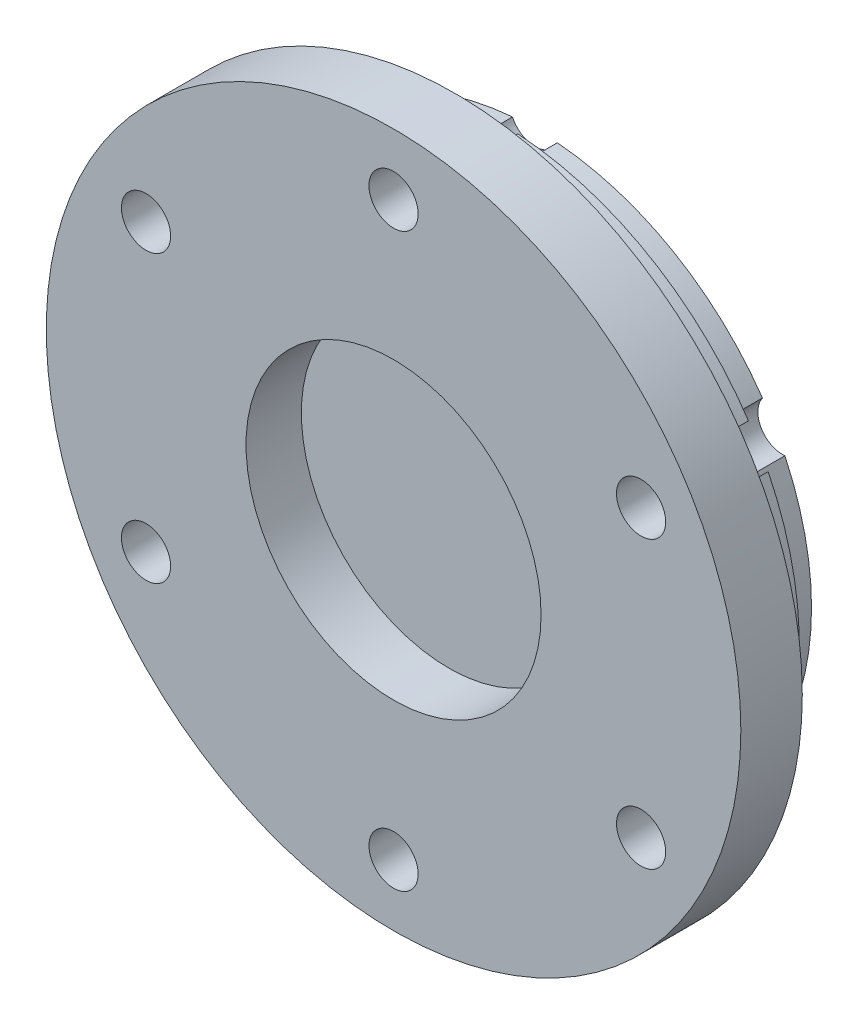
ISO-10303-21;
HEADER;
FILE_DESCRIPTION(('STEP AP214'),'2;1');
FILE_NAME('part.step','',(''),(''),'','','');
FILE_SCHEMA(('AUTOMOTIVE_DESIGN { 1 0 10303 214 1 1 1 1 }'));
ENDSEC;
DATA;
#1=APPLICATION_CONTEXT('core data for automotive mechanical design processes');
#2=APPLICATION_PROTOCOL_DEFINITION('international standard','automotive_design',2000,#1);
#3=PRODUCT_CONTEXT('',#1,'mechanical');
#4=PRODUCT('Part','Part','',(#3));
#5=PRODUCT_RELATED_PRODUCT_CATEGORY('part','',(#4));
#6=PRODUCT_DEFINITION_FORMATION('','',#4);
#7=PRODUCT_DEFINITION_CONTEXT('part definition',#1,'design');
#8=PRODUCT_DEFINITION('design','',#6,#7);
#9=PRODUCT_DEFINITION_SHAPE('','',#8);
#10=(LENGTH_UNIT() NAMED_UNIT(*) SI_UNIT(.MILLI.,.METRE.));
#11=(NAMED_UNIT(*) PLANE_ANGLE_UNIT() SI_UNIT($,.RADIAN.));
#12=(NAMED_UNIT(*) SI_UNIT($,.STERADIAN.) SOLID_ANGLE_UNIT());
#13=UNCERTAINTY_MEASURE_WITH_UNIT(LENGTH_MEASURE(1.E-05),#10,'distance_accuracy_value','');
#14=(GEOMETRIC_REPRESENTATION_CONTEXT(3) GLOBAL_UNCERTAINTY_ASSIGNED_CONTEXT((#13)) GLOBAL_UNIT_ASSIGNED_CONTEXT((#10,
#11,#12)) REPRESENTATION_CONTEXT('',''));
#15=CARTESIAN_POINT('',(0.,0.,0.));
#16=DIRECTION('',(0.,0.,1.));
#17=DIRECTION('',(1.,0.,0.));
#18=AXIS2_PLACEMENT_3D('',#15,#16,#17);
#19=CARTESIAN_POINT('',(0.,0.,0.));
#20=DIRECTION('',(0.,0.,1.));
#21=DIRECTION('',(1.,0.,0.));
#22=AXIS2_PLACEMENT_3D('',#19,#20,#21);
#23=CYLINDRICAL_SURFACE('',#22,22.5);
#24=CARTESIAN_POINT('',(0.,0.,-11.5));
#25=DIRECTION('',(0.,0.,-1.));
#26=DIRECTION('',(-1.,0.,0.));
#27=AXIS2_PLACEMENT_3D('',#24,#25,#26);
#28=CIRCLE('',#27,22.5);
#29=CARTESIAN_POINT('',(1.8224017222735,22.4260752688172,-11.5));
#30=VERTEX_POINT('',#29);
#31=CARTESIAN_POINT('',(18.5103500288407,12.7912838217982,-11.5));
#32=VERTEX_POINT('',#31);
#33=EDGE_CURVE('E64',#30,#32,#28,.T.);
#34=ORIENTED_EDGE('',*,*,#33,.F.);
#35=DIRECTION('',(0.,0.,-1.));
#36=VECTOR('',#35,1.);
#37=CARTESIAN_POINT('',(1.82240172227348,22.4260752688172,-13.25));
#38=LINE('',#37,#36);
#39=CARTESIAN_POINT('',(1.82240172227348,22.4260752688172,-8.5));
#40=VERTEX_POINT('',#39);
#41=EDGE_CURVE('E218',#30,#40,#38,.F.);
#42=ORIENTED_EDGE('',*,*,#41,.T.);
#43=CARTESIAN_POINT('',(0.,0.,-8.5));
#44=DIRECTION('',(0.,0.,1.));
#45=DIRECTION('',(1.,0.,0.));
#46=AXIS2_PLACEMENT_3D('',#43,#44,#45);
#47=CIRCLE('',#46,22.5);
#48=CARTESIAN_POINT('',(18.5103500288408,12.7912838217981,-8.5));
#49=VERTEX_POINT('',#48);
#50=EDGE_CURVE('E254',#49,#40,#47,.T.);
#51=ORIENTED_EDGE('',*,*,#50,.F.);
#52=DIRECTION('',(0.,0.,-1.));
#53=VECTOR('',#52,1.);
#54=CARTESIAN_POINT('',(18.5103500288407,12.7912838217982,-13.25));
#55=LINE('',#54,#53);
#56=EDGE_CURVE('E220',#49,#32,#55,.T.);
#57=ORIENTED_EDGE('',*,*,#56,.T.);
#58=EDGE_LOOP('',(#34,#42,#51,#57));
#59=FACE_BOUND('',#58,.T.);
#60=ADVANCED_FACE('F48',(#59),#23,.T.);
#61=CARTESIAN_POINT('',(0.,0.,-11.5));
#62=DIRECTION('',(0.,0.,-1.));
#63=DIRECTION('',(-1.,0.,0.));
#64=AXIS2_PLACEMENT_3D('',#61,#62,#63);
#65=CIRCLE('',#64,22.5);
#66=CARTESIAN_POINT('',(20.3327517511143,9.63479144701948,-11.5));
#67=VERTEX_POINT('',#66);
#68=CARTESIAN_POINT('',(20.3327517511145,-9.63479144701905,-11.5));
#69=VERTEX_POINT('',#68);
#70=EDGE_CURVE('E548',#67,#69,#65,.T.);
#71=ORIENTED_EDGE('',*,*,#70,.F.);
#72=DIRECTION('',(0.,0.,-1.));
#73=VECTOR('',#72,1.);
#74=CARTESIAN_POINT('',(20.3327517511143,9.63479144701949,-13.25));
#75=LINE('',#74,#73);
#76=CARTESIAN_POINT('',(20.3327517511143,9.63479144701949,-8.5));
#77=VERTEX_POINT('',#76);
#78=EDGE_CURVE('E418',#67,#77,#75,.F.);
#79=ORIENTED_EDGE('',*,*,#78,.T.);
#80=CARTESIAN_POINT('',(20.3327517511144,-9.6347914470191,-8.5));
#81=VERTEX_POINT('',#80);
#82=EDGE_CURVE('E437',#81,#77,#47,.T.);
#83=ORIENTED_EDGE('',*,*,#82,.F.);
#84=DIRECTION('',(0.,0.,-1.));
#85=VECTOR('',#84,1.);
#86=CARTESIAN_POINT('',(20.3327517511145,-9.63479144701906,-13.25));
#87=LINE('',#86,#85);
#88=EDGE_CURVE('E414',#81,#69,#87,.T.);
#89=ORIENTED_EDGE('',*,*,#88,.T.);
#90=EDGE_LOOP('',(#71,#79,#83,#89));
#91=FACE_BOUND('',#90,.T.);
#92=ADVANCED_FACE('F556',(#91),#23,.T.);
#93=CARTESIAN_POINT('',(0.,0.,-11.5));
#94=DIRECTION('',(0.,0.,-1.));
#95=DIRECTION('',(-1.,0.,0.));
#96=AXIS2_PLACEMENT_3D('',#93,#94,#95);
#97=CIRCLE('',#96,22.5);
#98=CARTESIAN_POINT('',(18.510350028841,-12.7912838217978,-11.5));
#99=VERTEX_POINT('',#98);
#100=CARTESIAN_POINT('',(1.82240172227348,-22.4260752688172,-11.5));
#101=VERTEX_POINT('',#100);
#102=EDGE_CURVE('E542',#99,#101,#97,.T.);
#103=ORIENTED_EDGE('',*,*,#102,.F.);
#104=DIRECTION('',(0.,0.,-1.));
#105=VECTOR('',#104,1.);
#106=CARTESIAN_POINT('',(18.510350028841,-12.7912838217978,-13.25));
#107=LINE('',#106,#105);
#108=CARTESIAN_POINT('',(18.510350028841,-12.7912838217978,-8.5));
#109=VERTEX_POINT('',#108);
#110=EDGE_CURVE('E398',#99,#109,#107,.F.);
#111=ORIENTED_EDGE('',*,*,#110,.T.);
#112=CARTESIAN_POINT('',(1.82240172227344,-22.4260752688172,-8.5));
#113=VERTEX_POINT('',#112);
#114=EDGE_CURVE('E440',#113,#109,#47,.T.);
#115=ORIENTED_EDGE('',*,*,#114,.F.);
#116=DIRECTION('',(0.,0.,-1.));
#117=VECTOR('',#116,1.);
#118=CARTESIAN_POINT('',(1.82240172227348,-22.4260752688172,-13.25));
#119=LINE('',#118,#117);
#120=EDGE_CURVE('E394',#113,#101,#119,.T.);
#121=ORIENTED_EDGE('',*,*,#120,.T.);
#122=EDGE_LOOP('',(#103,#111,#115,#121));
#123=FACE_BOUND('',#122,.T.);
#124=ADVANCED_FACE('F566',(#123),#23,.T.);
#125=CARTESIAN_POINT('',(0.,0.,-11.5));
#126=DIRECTION('',(0.,0.,-1.));
#127=DIRECTION('',(-1.,0.,0.));
#128=AXIS2_PLACEMENT_3D('',#125,#126,#127);
#129=CIRCLE('',#128,22.5);
#130=CARTESIAN_POINT('',(-1.82240172227349,-22.4260752688172,-11.5));
#131=VERTEX_POINT('',#130);
#132=CARTESIAN_POINT('',(-18.5103500288408,-12.791283821798,-11.5));
#133=VERTEX_POINT('',#132);
#134=EDGE_CURVE('E458',#131,#133,#129,.T.);
#135=ORIENTED_EDGE('',*,*,#134,.F.);
#136=DIRECTION('',(0.,0.,-1.));
#137=VECTOR('',#136,1.);
#138=CARTESIAN_POINT('',(-1.82240172227348,-22.4260752688172,-13.25));
#139=LINE('',#138,#137);
#140=CARTESIAN_POINT('',(-1.82240172227348,-22.4260752688172,-8.5));
#141=VERTEX_POINT('',#140);
#142=EDGE_CURVE('E369',#131,#141,#139,.F.);
#143=ORIENTED_EDGE('',*,*,#142,.T.);
#144=CARTESIAN_POINT('',(-18.5103500288408,-12.791283821798,-8.5));
#145=VERTEX_POINT('',#144);
#146=EDGE_CURVE('E446',#145,#141,#47,.T.);
#147=ORIENTED_EDGE('',*,*,#146,.F.);
#148=DIRECTION('',(0.,0.,-1.));
#149=VECTOR('',#148,1.);
#150=CARTESIAN_POINT('',(-18.5103500288408,-12.791283821798,-13.25));
#151=LINE('',#150,#149);
#152=EDGE_CURVE('E361',#145,#133,#151,.T.);
#153=ORIENTED_EDGE('',*,*,#152,.T.);
#154=EDGE_LOOP('',(#135,#143,#147,#153));
#155=FACE_BOUND('',#154,.T.);
#156=ADVANCED_FACE('F456',(#155),#23,.T.);
#157=CARTESIAN_POINT('',(0.,0.,-11.5));
#158=DIRECTION('',(0.,0.,-1.));
#159=DIRECTION('',(-1.,0.,0.));
#160=AXIS2_PLACEMENT_3D('',#157,#158,#159);
#161=CIRCLE('',#160,22.5);
#162=CARTESIAN_POINT('',(-20.3327517511143,-9.63479144701935,-11.5));
#163=VERTEX_POINT('',#162);
#164=CARTESIAN_POINT('',(-20.3327517511144,9.63479144701921,-11.5));
#165=VERTEX_POINT('',#164);
#166=EDGE_CURVE('E531',#163,#165,#161,.T.);
#167=ORIENTED_EDGE('',*,*,#166,.F.);
#168=DIRECTION('',(0.,0.,-1.));
#169=VECTOR('',#168,1.);
#170=CARTESIAN_POINT('',(-20.3327517511143,-9.63479144701935,-13.25));
#171=LINE('',#170,#169);
#172=CARTESIAN_POINT('',(-20.3327517511143,-9.63479144701934,-8.5));
#173=VERTEX_POINT('',#172);
#174=EDGE_CURVE('E350',#163,#173,#171,.F.);
#175=ORIENTED_EDGE('',*,*,#174,.T.);
#176=CARTESIAN_POINT('',(-20.3327517511144,9.63479144701924,-8.5));
#177=VERTEX_POINT('',#176);
#178=EDGE_CURVE('E260',#177,#173,#47,.T.);
#179=ORIENTED_EDGE('',*,*,#178,.F.);
#180=DIRECTION('',(0.,0.,-1.));
#181=VECTOR('',#180,1.);
#182=CARTESIAN_POINT('',(-20.3327517511144,9.6347914470192,-13.25));
#183=LINE('',#182,#181);
#184=EDGE_CURVE('E357',#177,#165,#183,.T.);
#185=ORIENTED_EDGE('',*,*,#184,.T.);
#186=EDGE_LOOP('',(#167,#175,#179,#185));
#187=FACE_BOUND('',#186,.T.);
#188=ADVANCED_FACE('F588',(#187),#23,.T.);
#189=CARTESIAN_POINT('',(0.,0.,-11.5));
#190=DIRECTION('',(0.,0.,-1.));
#191=DIRECTION('',(-1.,0.,0.));
#192=AXIS2_PLACEMENT_3D('',#189,#190,#191);
#193=CIRCLE('',#192,22.5);
#194=CARTESIAN_POINT('',(-18.5103500288409,12.7912838217979,-11.5));
#195=VERTEX_POINT('',#194);
#196=CARTESIAN_POINT('',(-1.82240172227348,22.4260752688172,-11.5));
#197=VERTEX_POINT('',#196);
#198=EDGE_CURVE('E211',#195,#197,#193,.T.);
#199=ORIENTED_EDGE('',*,*,#198,.F.);
#200=DIRECTION('',(0.,0.,-1.));
#201=VECTOR('',#200,1.);
#202=CARTESIAN_POINT('',(-18.5103500288409,12.7912838217979,-13.25));
#203=LINE('',#202,#201);
#204=CARTESIAN_POINT('',(-18.5103500288409,12.7912838217979,-8.5));
#205=VERTEX_POINT('',#204);
#206=EDGE_CURVE('E489',#195,#205,#203,.F.);
#207=ORIENTED_EDGE('',*,*,#206,.T.);
#208=CARTESIAN_POINT('',(-1.82240172227344,22.4260752688172,-8.5));
#209=VERTEX_POINT('',#208);
#210=EDGE_CURVE('E255',#209,#205,#47,.T.);
#211=ORIENTED_EDGE('',*,*,#210,.F.);
#212=DIRECTION('',(0.,0.,-1.));
#213=VECTOR('',#212,1.);
#214=CARTESIAN_POINT('',(-1.82240172227348,22.4260752688172,-13.25));
#215=LINE('',#214,#213);
#216=EDGE_CURVE('E72',#209,#197,#215,.T.);
#217=ORIENTED_EDGE('',*,*,#216,.T.);
#218=EDGE_LOOP('',(#199,#207,#211,#217));
#219=FACE_BOUND('',#218,.T.);
#220=ADVANCED_FACE('F581',(#219),#23,.T.);
#221=CARTESIAN_POINT('',(0.,23.25,0.));
#222=DIRECTION('',(0.,0.,-1.));
#223=DIRECTION('',(-1.,0.,0.));
#224=AXIS2_PLACEMENT_3D('',#221,#222,#223);
#225=CYLINDRICAL_SURFACE('',#224,2.);
#226=CARTESIAN_POINT('',(0.,23.25,0.));
#227=DIRECTION('',(0.,0.,-1.));
#228=DIRECTION('',(-1.,0.,0.));
#229=AXIS2_PLACEMENT_3D('',#226,#227,#228);
#230=CIRCLE('',#229,2.);
#231=CARTESIAN_POINT('',(-2.,23.25,0.));
#232=VERTEX_POINT('',#231);
#233=EDGE_CURVE('E230',#232,#232,#230,.T.);
#234=ORIENTED_EDGE('',*,*,#233,.F.);
#235=EDGE_LOOP('',(#234));
#236=FACE_BOUND('',#235,.T.);
#237=CARTESIAN_POINT('',(0.,23.25,-11.5));
#238=DIRECTION('',(0.,0.,1.));
#239=DIRECTION('',(-1.,0.,0.));
#240=AXIS2_PLACEMENT_3D('',#237,#238,#239);
#241=CIRCLE('',#240,2.00000000000001);
#242=EDGE_CURVE('E208',#197,#30,#241,.T.);
#243=ORIENTED_EDGE('',*,*,#242,.F.);
#244=ORIENTED_EDGE('',*,*,#216,.F.);
#245=CARTESIAN_POINT('',(0.,23.25,-8.5));
#246=DIRECTION('',(0.,0.,1.));
#247=DIRECTION('',(1.,0.,0.));
#248=AXIS2_PLACEMENT_3D('',#245,#246,#247);
#249=CIRCLE('',#248,2.);
#250=CARTESIAN_POINT('',(-1.60181166131823,24.4475806451613,-8.5));
#251=VERTEX_POINT('',#250);
#252=EDGE_CURVE('E236',#251,#209,#249,.T.);
#253=ORIENTED_EDGE('',*,*,#252,.F.);
#254=DIRECTION('',(0.,0.,-1.));
#255=VECTOR('',#254,1.);
#256=CARTESIAN_POINT('',(-1.60181166131823,24.4475806451613,-13.25));
#257=LINE('',#256,#255);
#258=CARTESIAN_POINT('',(-1.60181166131823,24.4475806451613,-5.));
#259=VERTEX_POINT('',#258);
#260=EDGE_CURVE('E248',#259,#251,#257,.T.);
#261=ORIENTED_EDGE('',*,*,#260,.F.);
#262=CARTESIAN_POINT('',(0.,23.25,-5.));
#263=DIRECTION('',(0.,0.,1.));
#264=DIRECTION('',(1.,0.,0.));
#265=AXIS2_PLACEMENT_3D('',#262,#263,#264);
#266=CIRCLE('',#265,2.);
#267=CARTESIAN_POINT('',(1.60181166131823,24.4475806451613,-5.));
#268=VERTEX_POINT('',#267);
#269=EDGE_CURVE('E244',#268,#259,#266,.T.);
#270=ORIENTED_EDGE('',*,*,#269,.F.);
#271=DIRECTION('',(0.,0.,-1.));
#272=VECTOR('',#271,1.);
#273=CARTESIAN_POINT('',(1.60181166131823,24.4475806451613,-13.25));
#274=LINE('',#273,#272);
#275=CARTESIAN_POINT('',(1.60181166131823,24.4475806451613,-8.5));
#276=VERTEX_POINT('',#275);
#277=EDGE_CURVE('E234',#276,#268,#274,.F.);
#278=ORIENTED_EDGE('',*,*,#277,.F.);
#279=EDGE_CURVE('E228',#40,#276,#249,.T.);
#280=ORIENTED_EDGE('',*,*,#279,.F.);
#281=ORIENTED_EDGE('',*,*,#41,.F.);
#282=EDGE_LOOP('',(#243,#244,#253,#261,#270,#278,#280,#281));
#283=FACE_BOUND('',#282,.T.);
#284=ADVANCED_FACE('F225',(#236,#283),#225,.F.);
#285=CARTESIAN_POINT('',(-20.1350906379882,11.625,0.));
#286=DIRECTION('',(0.,0.,-1.));
#287=DIRECTION('',(-1.,0.,0.));
#288=AXIS2_PLACEMENT_3D('',#285,#286,#287);
#289=CYLINDRICAL_SURFACE('',#288,2.);
#290=CARTESIAN_POINT('',(-20.1350906379882,11.625,0.));
#291=DIRECTION('',(0.,0.,-1.));
#292=DIRECTION('',(-0.499999999999998,-0.86602540378444,0.));
#293=AXIS2_PLACEMENT_3D('',#290,#291,#292);
#294=CIRCLE('',#293,2.);
#295=CARTESIAN_POINT('',(-21.1350906379882,9.89294919243107,0.));
#296=VERTEX_POINT('',#295);
#297=EDGE_CURVE('E494',#296,#296,#294,.T.);
#298=ORIENTED_EDGE('',*,*,#297,.F.);
#299=EDGE_LOOP('',(#298));
#300=FACE_BOUND('',#299,.T.);
#301=CARTESIAN_POINT('',(-20.1350906379882,11.625,-11.5));
#302=DIRECTION('',(0.,0.,1.));
#303=DIRECTION('',(-1.,0.,0.));
#304=AXIS2_PLACEMENT_3D('',#301,#302,#303);
#305=CIRCLE('',#304,2.);
#306=EDGE_CURVE('E528',#165,#195,#305,.T.);
#307=ORIENTED_EDGE('',*,*,#306,.F.);
#308=ORIENTED_EDGE('',*,*,#184,.F.);
#309=CARTESIAN_POINT('',(-20.1350906379882,11.625,-8.5));
#310=DIRECTION('',(0.,0.,1.));
#311=DIRECTION('',(1.,0.,0.));
#312=AXIS2_PLACEMENT_3D('',#309,#310,#311);
#313=CIRCLE('',#312,2.);
#314=CARTESIAN_POINT('',(-21.9731317304376,10.8365807318008,-8.5));
#315=VERTEX_POINT('',#314);
#316=EDGE_CURVE('E343',#315,#177,#313,.T.);
#317=ORIENTED_EDGE('',*,*,#316,.F.);
#318=DIRECTION('',(0.,0.,-1.));
#319=VECTOR('',#318,1.);
#320=CARTESIAN_POINT('',(-21.9731317304376,10.8365807318008,-13.25));
#321=LINE('',#320,#319);
#322=CARTESIAN_POINT('',(-21.9731317304376,10.8365807318008,-5.));
#323=VERTEX_POINT('',#322);
#324=EDGE_CURVE('E337',#323,#315,#321,.T.);
#325=ORIENTED_EDGE('',*,*,#324,.F.);
#326=CARTESIAN_POINT('',(-20.1350906379882,11.625,-5.));
#327=DIRECTION('',(0.,0.,1.));
#328=DIRECTION('',(1.,0.,0.));
#329=AXIS2_PLACEMENT_3D('',#326,#327,#328);
#330=CIRCLE('',#329,2.);
#331=CARTESIAN_POINT('',(-20.3713200691193,13.6109999133603,-5.));
#332=VERTEX_POINT('',#331);
#333=EDGE_CURVE('E468',#332,#323,#330,.T.);
#334=ORIENTED_EDGE('',*,*,#333,.F.);
#335=DIRECTION('',(0.,0.,-1.));
#336=VECTOR('',#335,1.);
#337=CARTESIAN_POINT('',(-20.3713200691193,13.6109999133603,-13.25));
#338=LINE('',#337,#336);
#339=CARTESIAN_POINT('',(-20.3713200691193,13.6109999133603,-8.5));
#340=VERTEX_POINT('',#339);
#341=EDGE_CURVE('E472',#340,#332,#338,.F.);
#342=ORIENTED_EDGE('',*,*,#341,.F.);
#343=EDGE_CURVE('E477',#205,#340,#313,.T.);
#344=ORIENTED_EDGE('',*,*,#343,.F.);
#345=ORIENTED_EDGE('',*,*,#206,.F.);
#346=EDGE_LOOP('',(#307,#308,#317,#325,#334,#342,#344,#345));
#347=FACE_BOUND('',#346,.T.);
#348=ADVANCED_FACE('F593',(#300,#347),#289,.F.);
#349=CARTESIAN_POINT('',(-20.1350906379881,-11.6250000000001,0.));
#350=DIRECTION('',(0.,0.,-1.));
#351=DIRECTION('',(-1.,0.,0.));
#352=AXIS2_PLACEMENT_3D('',#349,#350,#351);
#353=CYLINDRICAL_SURFACE('',#352,2.);
#354=CARTESIAN_POINT('',(-20.1350906379881,-11.6250000000001,0.));
#355=DIRECTION('',(0.,0.,-1.));
#356=DIRECTION('',(0.500000000000004,-0.866025403784436,0.));
#357=AXIS2_PLACEMENT_3D('',#354,#355,#356);
#358=CIRCLE('',#357,2.);
#359=CARTESIAN_POINT('',(-19.1350906379881,-13.357050807569,0.));
#360=VERTEX_POINT('',#359);
#361=EDGE_CURVE('E500',#360,#360,#358,.T.);
#362=ORIENTED_EDGE('',*,*,#361,.F.);
#363=EDGE_LOOP('',(#362));
#364=FACE_BOUND('',#363,.T.);
#365=CARTESIAN_POINT('',(-20.1350906379881,-11.6250000000001,-11.5));
#366=DIRECTION('',(0.,0.,1.));
#367=DIRECTION('',(-1.,0.,0.));
#368=AXIS2_PLACEMENT_3D('',#365,#366,#367);
#369=CIRCLE('',#368,2.);
#370=EDGE_CURVE('E534',#133,#163,#369,.T.);
#371=ORIENTED_EDGE('',*,*,#370,.F.);
#372=ORIENTED_EDGE('',*,*,#152,.F.);
#373=CARTESIAN_POINT('',(-20.1350906379881,-11.6250000000001,-8.5));
#374=DIRECTION('',(0.,0.,1.));
#375=DIRECTION('',(1.,0.,0.));
#376=AXIS2_PLACEMENT_3D('',#373,#374,#375);
#377=CIRCLE('',#376,2.);
#378=CARTESIAN_POINT('',(-20.3713200691192,-13.6109999133605,-8.5));
#379=VERTEX_POINT('',#378);
#380=EDGE_CURVE('E352',#379,#145,#377,.T.);
#381=ORIENTED_EDGE('',*,*,#380,.F.);
#382=DIRECTION('',(0.,0.,-1.));
#383=VECTOR('',#382,1.);
#384=CARTESIAN_POINT('',(-20.3713200691192,-13.6109999133605,-13.25));
#385=LINE('',#384,#383);
#386=CARTESIAN_POINT('',(-20.3713200691192,-13.6109999133605,-5.));
#387=VERTEX_POINT('',#386);
#388=EDGE_CURVE('E362',#387,#379,#385,.T.);
#389=ORIENTED_EDGE('',*,*,#388,.F.);
#390=CARTESIAN_POINT('',(-20.1350906379881,-11.6250000000001,-5.));
#391=DIRECTION('',(0.,0.,1.));
#392=DIRECTION('',(1.,0.,0.));
#393=AXIS2_PLACEMENT_3D('',#390,#391,#392);
#394=CIRCLE('',#393,2.);
#395=CARTESIAN_POINT('',(-21.9731317304375,-10.836580731801,-5.));
#396=VERTEX_POINT('',#395);
#397=EDGE_CURVE('E355',#396,#387,#394,.T.);
#398=ORIENTED_EDGE('',*,*,#397,.F.);
#399=DIRECTION('',(0.,0.,-1.));
#400=VECTOR('',#399,1.);
#401=CARTESIAN_POINT('',(-21.9731317304375,-10.836580731801,-13.25));
#402=LINE('',#401,#400);
#403=CARTESIAN_POINT('',(-21.9731317304375,-10.836580731801,-8.5));
#404=VERTEX_POINT('',#403);
#405=EDGE_CURVE('E335',#404,#396,#402,.F.);
#406=ORIENTED_EDGE('',*,*,#405,.F.);
#407=EDGE_CURVE('E346',#173,#404,#377,.T.);
#408=ORIENTED_EDGE('',*,*,#407,.F.);
#409=ORIENTED_EDGE('',*,*,#174,.F.);
#410=EDGE_LOOP('',(#371,#372,#381,#389,#398,#406,#408,#409));
#411=FACE_BOUND('',#410,.T.);
#412=ADVANCED_FACE('F646',(#364,#411),#353,.F.);
#413=CARTESIAN_POINT('',(0.,-23.25,0.));
#414=DIRECTION('',(0.,0.,-1.));
#415=DIRECTION('',(-1.,0.,0.));
#416=AXIS2_PLACEMENT_3D('',#413,#414,#415);
#417=CYLINDRICAL_SURFACE('',#416,2.);
#418=CARTESIAN_POINT('',(0.,-23.25,0.));
#419=DIRECTION('',(0.,0.,-1.));
#420=DIRECTION('',(1.,0.,0.));
#421=AXIS2_PLACEMENT_3D('',#418,#419,#420);
#422=CIRCLE('',#421,2.);
#423=CARTESIAN_POINT('',(2.,-23.25,0.));
#424=VERTEX_POINT('',#423);
#425=EDGE_CURVE('E512',#424,#424,#422,.T.);
#426=ORIENTED_EDGE('',*,*,#425,.F.);
#427=EDGE_LOOP('',(#426));
#428=FACE_BOUND('',#427,.T.);
#429=CARTESIAN_POINT('',(0.,-23.25,-11.5));
#430=DIRECTION('',(0.,0.,1.));
#431=DIRECTION('',(-1.,0.,0.));
#432=AXIS2_PLACEMENT_3D('',#429,#430,#431);
#433=CIRCLE('',#432,2.00000000000001);
#434=EDGE_CURVE('E539',#101,#131,#433,.T.);
#435=ORIENTED_EDGE('',*,*,#434,.F.);
#436=ORIENTED_EDGE('',*,*,#120,.F.);
#437=CARTESIAN_POINT('',(0.,-23.25,-8.5));
#438=DIRECTION('',(0.,0.,1.));
#439=DIRECTION('',(1.,0.,0.));
#440=AXIS2_PLACEMENT_3D('',#437,#438,#439);
#441=CIRCLE('',#440,2.);
#442=CARTESIAN_POINT('',(1.60181166131823,-24.4475806451613,-8.5));
#443=VERTEX_POINT('',#442);
#444=EDGE_CURVE('E384',#443,#113,#441,.T.);
#445=ORIENTED_EDGE('',*,*,#444,.F.);
#446=DIRECTION('',(0.,0.,-1.));
#447=VECTOR('',#446,1.);
#448=CARTESIAN_POINT('',(1.60181166131823,-24.4475806451613,-13.25));
#449=LINE('',#448,#447);
#450=CARTESIAN_POINT('',(1.60181166131823,-24.4475806451613,-5.));
#451=VERTEX_POINT('',#450);
#452=EDGE_CURVE('E391',#451,#443,#449,.T.);
#453=ORIENTED_EDGE('',*,*,#452,.F.);
#454=CARTESIAN_POINT('',(0.,-23.25,-5.));
#455=DIRECTION('',(0.,0.,1.));
#456=DIRECTION('',(1.,0.,0.));
#457=AXIS2_PLACEMENT_3D('',#454,#455,#456);
#458=CIRCLE('',#457,2.);
#459=CARTESIAN_POINT('',(-1.60181166131823,-24.4475806451613,-5.));
#460=VERTEX_POINT('',#459);
#461=EDGE_CURVE('E387',#460,#451,#458,.T.);
#462=ORIENTED_EDGE('',*,*,#461,.F.);
#463=DIRECTION('',(0.,0.,-1.));
#464=VECTOR('',#463,1.);
#465=CARTESIAN_POINT('',(-1.60181166131823,-24.4475806451613,-13.25));
#466=LINE('',#465,#464);
#467=CARTESIAN_POINT('',(-1.60181166131823,-24.4475806451613,-8.5));
#468=VERTEX_POINT('',#467);
#469=EDGE_CURVE('E383',#468,#460,#466,.F.);
#470=ORIENTED_EDGE('',*,*,#469,.F.);
#471=EDGE_CURVE('E379',#141,#468,#441,.T.);
#472=ORIENTED_EDGE('',*,*,#471,.F.);
#473=ORIENTED_EDGE('',*,*,#142,.F.);
#474=EDGE_LOOP('',(#435,#436,#445,#453,#462,#470,#472,#473));
#475=FACE_BOUND('',#474,.T.);
#476=ADVANCED_FACE('F461',(#428,#475),#417,.F.);
#477=CARTESIAN_POINT('',(20.1350906379883,-11.6249999999998,0.));
#478=DIRECTION('',(0.,0.,-1.));
#479=DIRECTION('',(-1.,0.,0.));
#480=AXIS2_PLACEMENT_3D('',#477,#478,#479);
#481=CYLINDRICAL_SURFACE('',#480,2.);
#482=CARTESIAN_POINT('',(20.1350906379883,-11.6249999999998,0.));
#483=DIRECTION('',(0.,0.,-1.));
#484=DIRECTION('',(0.499999999999992,0.866025403784443,0.));
#485=AXIS2_PLACEMENT_3D('',#482,#483,#484);
#486=CIRCLE('',#485,2.);
#487=CARTESIAN_POINT('',(21.1350906379883,-9.89294919243093,0.));
#488=VERTEX_POINT('',#487);
#489=EDGE_CURVE('E507',#488,#488,#486,.T.);
#490=ORIENTED_EDGE('',*,*,#489,.F.);
#491=EDGE_LOOP('',(#490));
#492=FACE_BOUND('',#491,.T.);
#493=CARTESIAN_POINT('',(20.1350906379883,-11.6249999999998,-11.5));
#494=DIRECTION('',(0.,0.,1.));
#495=DIRECTION('',(-1.,0.,0.));
#496=AXIS2_PLACEMENT_3D('',#493,#494,#495);
#497=CIRCLE('',#496,2.00000000000001);
#498=EDGE_CURVE('E545',#69,#99,#497,.T.);
#499=ORIENTED_EDGE('',*,*,#498,.F.);
#500=ORIENTED_EDGE('',*,*,#88,.F.);
#501=CARTESIAN_POINT('',(20.1350906379883,-11.6249999999998,-8.5));
#502=DIRECTION('',(0.,0.,1.));
#503=DIRECTION('',(1.,0.,0.));
#504=AXIS2_PLACEMENT_3D('',#501,#502,#503);
#505=CIRCLE('',#504,2.);
#506=CARTESIAN_POINT('',(21.9731317304376,-10.8365807318007,-8.5));
#507=VERTEX_POINT('',#506);
#508=EDGE_CURVE('E406',#507,#81,#505,.T.);
#509=ORIENTED_EDGE('',*,*,#508,.F.);
#510=DIRECTION('',(0.,0.,-1.));
#511=VECTOR('',#510,1.);
#512=CARTESIAN_POINT('',(21.9731317304376,-10.8365807318007,-13.25));
#513=LINE('',#512,#511);
#514=CARTESIAN_POINT('',(21.9731317304376,-10.8365807318007,-5.));
#515=VERTEX_POINT('',#514);
#516=EDGE_CURVE('E411',#515,#507,#513,.T.);
#517=ORIENTED_EDGE('',*,*,#516,.F.);
#518=CARTESIAN_POINT('',(20.1350906379883,-11.6249999999998,-5.));
#519=DIRECTION('',(0.,0.,1.));
#520=DIRECTION('',(1.,0.,0.));
#521=AXIS2_PLACEMENT_3D('',#518,#519,#520);
#522=CIRCLE('',#521,2.);
#523=CARTESIAN_POINT('',(20.3713200691194,-13.6109999133602,-5.));
#524=VERTEX_POINT('',#523);
#525=EDGE_CURVE('E290',#524,#515,#522,.T.);
#526=ORIENTED_EDGE('',*,*,#525,.F.);
#527=DIRECTION('',(0.,0.,-1.));
#528=VECTOR('',#527,1.);
#529=CARTESIAN_POINT('',(20.3713200691194,-13.6109999133602,-13.25));
#530=LINE('',#529,#528);
#531=CARTESIAN_POINT('',(20.3713200691194,-13.6109999133602,-8.5));
#532=VERTEX_POINT('',#531);
#533=EDGE_CURVE('E405',#532,#524,#530,.F.);
#534=ORIENTED_EDGE('',*,*,#533,.F.);
#535=EDGE_CURVE('E401',#109,#532,#505,.T.);
#536=ORIENTED_EDGE('',*,*,#535,.F.);
#537=ORIENTED_EDGE('',*,*,#110,.F.);
#538=EDGE_LOOP('',(#499,#500,#509,#517,#526,#534,#536,#537));
#539=FACE_BOUND('',#538,.T.);
#540=ADVANCED_FACE('F569',(#492,#539),#481,.F.);
#541=CARTESIAN_POINT('',(20.1350906379881,11.6250000000002,0.));
#542=DIRECTION('',(0.,0.,-1.));
#543=DIRECTION('',(-1.,0.,0.));
#544=AXIS2_PLACEMENT_3D('',#541,#542,#543);
#545=CYLINDRICAL_SURFACE('',#544,2.);
#546=CARTESIAN_POINT('',(20.1350906379881,11.6250000000002,0.));
#547=DIRECTION('',(0.,0.,-1.));
#548=DIRECTION('',(-0.50000000000001,0.866025403784433,0.));
#549=AXIS2_PLACEMENT_3D('',#546,#547,#548);
#550=CIRCLE('',#549,2.);
#551=CARTESIAN_POINT('',(19.135090637988,13.3570508075691,0.));
#552=VERTEX_POINT('',#551);
#553=EDGE_CURVE('E503',#552,#552,#550,.T.);
#554=ORIENTED_EDGE('',*,*,#553,.F.);
#555=EDGE_LOOP('',(#554));
#556=FACE_BOUND('',#555,.T.);
#557=CARTESIAN_POINT('',(20.1350906379881,11.6250000000002,-11.5));
#558=DIRECTION('',(0.,0.,1.));
#559=DIRECTION('',(-1.,0.,0.));
#560=AXIS2_PLACEMENT_3D('',#557,#558,#559);
#561=CIRCLE('',#560,2.00000000000001);
#562=EDGE_CURVE('E222',#32,#67,#561,.T.);
#563=ORIENTED_EDGE('',*,*,#562,.F.);
#564=ORIENTED_EDGE('',*,*,#56,.F.);
#565=CARTESIAN_POINT('',(20.1350906379881,11.6250000000002,-8.5));
#566=DIRECTION('',(0.,0.,1.));
#567=DIRECTION('',(1.,0.,0.));
#568=AXIS2_PLACEMENT_3D('',#565,#566,#567);
#569=CIRCLE('',#568,2.);
#570=CARTESIAN_POINT('',(20.3713200691192,13.6109999133606,-8.5));
#571=VERTEX_POINT('',#570);
#572=EDGE_CURVE('E426',#571,#49,#569,.T.);
#573=ORIENTED_EDGE('',*,*,#572,.F.);
#574=DIRECTION('',(0.,0.,-1.));
#575=VECTOR('',#574,1.);
#576=CARTESIAN_POINT('',(20.3713200691192,13.6109999133606,-13.25));
#577=LINE('',#576,#575);
#578=CARTESIAN_POINT('',(20.3713200691192,13.6109999133606,-5.));
#579=VERTEX_POINT('',#578);
#580=EDGE_CURVE('E305',#579,#571,#577,.T.);
#581=ORIENTED_EDGE('',*,*,#580,.F.);
#582=CARTESIAN_POINT('',(20.1350906379881,11.6250000000002,-5.));
#583=DIRECTION('',(0.,0.,1.));
#584=DIRECTION('',(1.,0.,0.));
#585=AXIS2_PLACEMENT_3D('',#582,#583,#584);
#586=CIRCLE('',#585,2.);
#587=CARTESIAN_POINT('',(21.9731317304374,10.8365807318012,-5.));
#588=VERTEX_POINT('',#587);
#589=EDGE_CURVE('E287',#588,#579,#586,.T.);
#590=ORIENTED_EDGE('',*,*,#589,.F.);
#591=DIRECTION('',(0.,0.,-1.));
#592=VECTOR('',#591,1.);
#593=CARTESIAN_POINT('',(21.9731317304374,10.8365807318012,-13.25));
#594=LINE('',#593,#592);
#595=CARTESIAN_POINT('',(21.9731317304374,10.8365807318012,-8.5));
#596=VERTEX_POINT('',#595);
#597=EDGE_CURVE('E425',#596,#588,#594,.F.);
#598=ORIENTED_EDGE('',*,*,#597,.F.);
#599=EDGE_CURVE('E421',#77,#596,#569,.T.);
#600=ORIENTED_EDGE('',*,*,#599,.F.);
#601=ORIENTED_EDGE('',*,*,#78,.F.);
#602=EDGE_LOOP('',(#563,#564,#573,#581,#590,#598,#600,#601));
#603=FACE_BOUND('',#602,.T.);
#604=ADVANCED_FACE('F558',(#556,#603),#545,.F.);
#605=CARTESIAN_POINT('',(0.,0.,0.));
#606=DIRECTION('',(0.,0.,1.));
#607=DIRECTION('',(1.,0.,0.));
#608=AXIS2_PLACEMENT_3D('',#605,#606,#607);
#609=CYLINDRICAL_SURFACE('',#608,24.5);
#610=CARTESIAN_POINT('',(0.,0.,-5.));
#611=DIRECTION('',(0.,0.,1.));
#612=DIRECTION('',(1.,0.,0.));
#613=AXIS2_PLACEMENT_3D('',#610,#611,#612);
#614=CIRCLE('',#613,24.5);
#615=EDGE_CURVE('E265',#579,#268,#614,.T.);
#616=ORIENTED_EDGE('',*,*,#615,.F.);
#617=ORIENTED_EDGE('',*,*,#580,.T.);
#618=CARTESIAN_POINT('',(0.,0.,-8.5));
#619=DIRECTION('',(0.,0.,1.));
#620=DIRECTION('',(1.,0.,0.));
#621=AXIS2_PLACEMENT_3D('',#618,#619,#620);
#622=CIRCLE('',#621,24.5);
#623=EDGE_CURVE('E259',#571,#276,#622,.T.);
#624=ORIENTED_EDGE('',*,*,#623,.T.);
#625=ORIENTED_EDGE('',*,*,#277,.T.);
#626=EDGE_LOOP('',(#616,#617,#624,#625));
#627=FACE_BOUND('',#626,.T.);
#628=ADVANCED_FACE('F303',(#627),#609,.T.);
#629=EDGE_CURVE('E309',#507,#596,#622,.T.);
#630=ORIENTED_EDGE('',*,*,#629,.T.);
#631=ORIENTED_EDGE('',*,*,#597,.T.);
#632=EDGE_CURVE('E286',#515,#588,#614,.T.);
#633=ORIENTED_EDGE('',*,*,#632,.F.);
#634=ORIENTED_EDGE('',*,*,#516,.T.);
#635=EDGE_LOOP('',(#630,#631,#633,#634));
#636=FACE_BOUND('',#635,.T.);
#637=ADVANCED_FACE('F572',(#636),#609,.T.);
#638=EDGE_CURVE('E312',#443,#532,#622,.T.);
#639=ORIENTED_EDGE('',*,*,#638,.T.);
#640=ORIENTED_EDGE('',*,*,#533,.T.);
#641=EDGE_CURVE('E295',#451,#524,#614,.T.);
#642=ORIENTED_EDGE('',*,*,#641,.F.);
#643=ORIENTED_EDGE('',*,*,#452,.T.);
#644=EDGE_LOOP('',(#639,#640,#642,#643));
#645=FACE_BOUND('',#644,.T.);
#646=ADVANCED_FACE('F570',(#645),#609,.T.);
#647=EDGE_CURVE('E316',#379,#468,#622,.T.);
#648=ORIENTED_EDGE('',*,*,#647,.T.);
#649=ORIENTED_EDGE('',*,*,#469,.T.);
#650=EDGE_CURVE('E298',#387,#460,#614,.T.);
#651=ORIENTED_EDGE('',*,*,#650,.F.);
#652=ORIENTED_EDGE('',*,*,#388,.T.);
#653=EDGE_LOOP('',(#648,#649,#651,#652));
#654=FACE_BOUND('',#653,.T.);
#655=ADVANCED_FACE('F463',(#654),#609,.T.);
#656=EDGE_CURVE('E266',#315,#404,#622,.T.);
#657=ORIENTED_EDGE('',*,*,#656,.T.);
#658=ORIENTED_EDGE('',*,*,#405,.T.);
#659=EDGE_CURVE('E270',#323,#396,#614,.T.);
#660=ORIENTED_EDGE('',*,*,#659,.F.);
#661=ORIENTED_EDGE('',*,*,#324,.T.);
#662=EDGE_LOOP('',(#657,#658,#660,#661));
#663=FACE_BOUND('',#662,.T.);
#664=ADVANCED_FACE('F333',(#663),#609,.T.);
#665=CARTESIAN_POINT('',(0.,24.5,-8.5));
#666=DIRECTION('',(0.,0.,1.));
#667=DIRECTION('',(1.,0.,0.));
#668=AXIS2_PLACEMENT_3D('',#665,#666,#667);
#669=PLANE('',#668);
#670=ORIENTED_EDGE('',*,*,#623,.F.);
#671=ORIENTED_EDGE('',*,*,#572,.T.);
#672=ORIENTED_EDGE('',*,*,#50,.T.);
#673=ORIENTED_EDGE('',*,*,#279,.T.);
#674=EDGE_LOOP('',(#670,#671,#672,#673));
#675=FACE_BOUND('',#674,.T.);
#676=ADVANCED_FACE('F434',(#675),#669,.F.);
#677=ORIENTED_EDGE('',*,*,#82,.T.);
#678=ORIENTED_EDGE('',*,*,#599,.T.);
#679=ORIENTED_EDGE('',*,*,#629,.F.);
#680=ORIENTED_EDGE('',*,*,#508,.T.);
#681=EDGE_LOOP('',(#677,#678,#679,#680));
#682=FACE_BOUND('',#681,.T.);
#683=ADVANCED_FACE('F559',(#682),#669,.F.);
#684=ORIENTED_EDGE('',*,*,#146,.T.);
#685=ORIENTED_EDGE('',*,*,#471,.T.);
#686=ORIENTED_EDGE('',*,*,#647,.F.);
#687=ORIENTED_EDGE('',*,*,#380,.T.);
#688=EDGE_LOOP('',(#684,#685,#686,#687));
#689=FACE_BOUND('',#688,.T.);
#690=ADVANCED_FACE('F452',(#689),#669,.F.);
#691=ORIENTED_EDGE('',*,*,#178,.T.);
#692=ORIENTED_EDGE('',*,*,#407,.T.);
#693=ORIENTED_EDGE('',*,*,#656,.F.);
#694=ORIENTED_EDGE('',*,*,#316,.T.);
#695=EDGE_LOOP('',(#691,#692,#693,#694));
#696=FACE_BOUND('',#695,.T.);
#697=ADVANCED_FACE('F342',(#696),#669,.F.);
#698=ORIENTED_EDGE('',*,*,#210,.T.);
#699=ORIENTED_EDGE('',*,*,#343,.T.);
#700=EDGE_CURVE('E261',#251,#340,#622,.T.);
#701=ORIENTED_EDGE('',*,*,#700,.F.);
#702=ORIENTED_EDGE('',*,*,#252,.T.);
#703=EDGE_LOOP('',(#698,#699,#701,#702));
#704=FACE_BOUND('',#703,.T.);
#705=ADVANCED_FACE('F596',(#704),#669,.F.);
#706=CARTESIAN_POINT('',(0.,0.,0.));
#707=DIRECTION('',(0.,0.,-1.));
#708=DIRECTION('',(-1.,0.,0.));
#709=AXIS2_PLACEMENT_3D('',#706,#707,#708);
#710=PLANE('',#709);
#711=CARTESIAN_POINT('',(0.,0.,0.));
#712=DIRECTION('',(0.,0.,1.));
#713=DIRECTION('',(1.,0.,0.));
#714=AXIS2_PLACEMENT_3D('',#711,#712,#713);
#715=CIRCLE('',#714,12.);
#716=CARTESIAN_POINT('',(12.,0.,0.));
#717=VERTEX_POINT('',#716);
#718=EDGE_CURVE('E519',#717,#717,#715,.T.);
#719=ORIENTED_EDGE('',*,*,#718,.F.);
#720=EDGE_LOOP('',(#719));
#721=FACE_BOUND('',#720,.T.);
#722=ORIENTED_EDGE('',*,*,#553,.T.);
#723=EDGE_LOOP('',(#722));
#724=FACE_BOUND('',#723,.T.);
#725=ORIENTED_EDGE('',*,*,#489,.T.);
#726=EDGE_LOOP('',(#725));
#727=FACE_BOUND('',#726,.T.);
#728=ORIENTED_EDGE('',*,*,#425,.T.);
#729=EDGE_LOOP('',(#728));
#730=FACE_BOUND('',#729,.T.);
#731=ORIENTED_EDGE('',*,*,#361,.T.);
#732=EDGE_LOOP('',(#731));
#733=FACE_BOUND('',#732,.T.);
#734=ORIENTED_EDGE('',*,*,#297,.T.);
#735=EDGE_LOOP('',(#734));
#736=FACE_BOUND('',#735,.T.);
#737=ORIENTED_EDGE('',*,*,#233,.T.);
#738=EDGE_LOOP('',(#737));
#739=FACE_BOUND('',#738,.T.);
#740=CARTESIAN_POINT('',(0.,0.,0.));
#741=DIRECTION('',(0.,0.,1.));
#742=DIRECTION('',(1.,0.,0.));
#743=AXIS2_PLACEMENT_3D('',#740,#741,#742);
#744=CIRCLE('',#743,28.25);
#745=CARTESIAN_POINT('',(28.25,0.,0.));
#746=VERTEX_POINT('',#745);
#747=EDGE_CURVE('E12',#746,#746,#744,.T.);
#748=ORIENTED_EDGE('',*,*,#747,.T.);
#749=EDGE_LOOP('',(#748));
#750=FACE_BOUND('',#749,.T.);
#751=ADVANCED_FACE('F50',(#721,#724,#727,#730,#733,#736,#739,#750),#710,.F.);
#752=CARTESIAN_POINT('',(0.,0.,0.));
#753=DIRECTION('',(0.,0.,1.));
#754=DIRECTION('',(1.,0.,0.));
#755=AXIS2_PLACEMENT_3D('',#752,#753,#754);
#756=CYLINDRICAL_SURFACE('',#755,28.25);
#757=ORIENTED_EDGE('',*,*,#747,.F.);
#758=EDGE_LOOP('',(#757));
#759=FACE_BOUND('',#758,.T.);
#760=CARTESIAN_POINT('',(0.,0.,-5.));
#761=DIRECTION('',(0.,0.,1.));
#762=DIRECTION('',(1.,0.,0.));
#763=AXIS2_PLACEMENT_3D('',#760,#761,#762);
#764=CIRCLE('',#763,28.25);
#765=CARTESIAN_POINT('',(28.25,0.,-5.));
#766=VERTEX_POINT('',#765);
#767=EDGE_CURVE('E57',#766,#766,#764,.T.);
#768=ORIENTED_EDGE('',*,*,#767,.T.);
#769=EDGE_LOOP('',(#768));
#770=FACE_BOUND('',#769,.T.);
#771=ADVANCED_FACE('F275',(#759,#770),#756,.T.);
#772=CARTESIAN_POINT('',(0.,28.25,-5.));
#773=DIRECTION('',(0.,0.,1.));
#774=DIRECTION('',(1.,0.,0.));
#775=AXIS2_PLACEMENT_3D('',#772,#773,#774);
#776=PLANE('',#775);
#777=ORIENTED_EDGE('',*,*,#767,.F.);
#778=EDGE_LOOP('',(#777));
#779=FACE_BOUND('',#778,.T.);
#780=ORIENTED_EDGE('',*,*,#632,.T.);
#781=ORIENTED_EDGE('',*,*,#589,.T.);
#782=ORIENTED_EDGE('',*,*,#615,.T.);
#783=ORIENTED_EDGE('',*,*,#269,.T.);
#784=EDGE_CURVE('E267',#259,#332,#614,.T.);
#785=ORIENTED_EDGE('',*,*,#784,.T.);
#786=ORIENTED_EDGE('',*,*,#333,.T.);
#787=ORIENTED_EDGE('',*,*,#659,.T.);
#788=ORIENTED_EDGE('',*,*,#397,.T.);
#789=ORIENTED_EDGE('',*,*,#650,.T.);
#790=ORIENTED_EDGE('',*,*,#461,.T.);
#791=ORIENTED_EDGE('',*,*,#641,.T.);
#792=ORIENTED_EDGE('',*,*,#525,.T.);
#793=EDGE_LOOP('',(#780,#781,#782,#783,#785,#786,#787,#788,#789,#790,#791,#792));
#794=FACE_BOUND('',#793,.T.);
#795=ADVANCED_FACE('F277',(#779,#794),#776,.F.);
#796=ORIENTED_EDGE('',*,*,#700,.T.);
#797=ORIENTED_EDGE('',*,*,#341,.T.);
#798=ORIENTED_EDGE('',*,*,#784,.F.);
#799=ORIENTED_EDGE('',*,*,#260,.T.);
#800=EDGE_LOOP('',(#796,#797,#798,#799));
#801=FACE_BOUND('',#800,.T.);
#802=ADVANCED_FACE('F280',(#801),#609,.T.);
#803=ORIENTED_EDGE('',*,*,#114,.T.);
#804=ORIENTED_EDGE('',*,*,#535,.T.);
#805=ORIENTED_EDGE('',*,*,#638,.F.);
#806=ORIENTED_EDGE('',*,*,#444,.T.);
#807=EDGE_LOOP('',(#803,#804,#805,#806));
#808=FACE_BOUND('',#807,.T.);
#809=ADVANCED_FACE('F563',(#808),#669,.F.);
#810=CARTESIAN_POINT('',(0.,0.,-4.5));
#811=DIRECTION('',(0.,0.,1.));
#812=DIRECTION('',(1.,0.,0.));
#813=AXIS2_PLACEMENT_3D('',#810,#811,#812);
#814=CYLINDRICAL_SURFACE('',#813,12.);
#815=CARTESIAN_POINT('',(0.,0.,-4.5));
#816=DIRECTION('',(0.,0.,1.));
#817=DIRECTION('',(1.,0.,0.));
#818=AXIS2_PLACEMENT_3D('',#815,#816,#817);
#819=CIRCLE('',#818,12.);
#820=CARTESIAN_POINT('',(12.,0.,-4.5));
#821=VERTEX_POINT('',#820);
#822=EDGE_CURVE('E508',#821,#821,#819,.T.);
#823=ORIENTED_EDGE('',*,*,#822,.F.);
#824=EDGE_LOOP('',(#823));
#825=FACE_BOUND('',#824,.T.);
#826=ORIENTED_EDGE('',*,*,#718,.T.);
#827=EDGE_LOOP('',(#826));
#828=FACE_BOUND('',#827,.T.);
#829=ADVANCED_FACE('F603',(#825,#828),#814,.F.);
#830=CARTESIAN_POINT('',(0.,0.,-4.5));
#831=DIRECTION('',(0.,0.,1.));
#832=DIRECTION('',(1.,0.,0.));
#833=AXIS2_PLACEMENT_3D('',#830,#831,#832);
#834=PLANE('',#833);
#835=ORIENTED_EDGE('',*,*,#822,.T.);
#836=EDGE_LOOP('',(#835));
#837=FACE_BOUND('',#836,.T.);
#838=ADVANCED_FACE('F665',(#837),#834,.T.);
#839=CARTESIAN_POINT('',(0.,11.625,-11.5));
#840=DIRECTION('',(0.,0.,-1.));
#841=DIRECTION('',(-1.,0.,0.));
#842=AXIS2_PLACEMENT_3D('',#839,#840,#841);
#843=PLANE('',#842);
#844=ORIENTED_EDGE('',*,*,#242,.T.);
#845=ORIENTED_EDGE('',*,*,#33,.T.);
#846=ORIENTED_EDGE('',*,*,#562,.T.);
#847=ORIENTED_EDGE('',*,*,#70,.T.);
#848=ORIENTED_EDGE('',*,*,#498,.T.);
#849=ORIENTED_EDGE('',*,*,#102,.T.);
#850=ORIENTED_EDGE('',*,*,#434,.T.);
#851=ORIENTED_EDGE('',*,*,#134,.T.);
#852=ORIENTED_EDGE('',*,*,#370,.T.);
#853=ORIENTED_EDGE('',*,*,#166,.T.);
#854=ORIENTED_EDGE('',*,*,#306,.T.);
#855=ORIENTED_EDGE('',*,*,#198,.T.);
#856=EDGE_LOOP('',(#844,#845,#846,#847,#848,#849,#850,#851,#852,#853,#854,#855));
#857=FACE_BOUND('',#856,.T.);
#858=ADVANCED_FACE('F209',(#857),#843,.T.);
#859=CLOSED_SHELL('',(#60,#92,#124,#156,#188,#220,#284,#348,#412,#476,#540,#604,#628,#637,#646,
#655,#664,#676,#683,#690,#697,#705,#751,#771,#795,#802,#809,#829,#838,#858));
#860=MANIFOLD_SOLID_BREP('B2',#859);
#861=ADVANCED_BREP_SHAPE_REPRESENTATION('',(#18,#860),#14);
#862=SHAPE_DEFINITION_REPRESENTATION(#9,#861);
ENDSEC;
END-ISO-10303-21;
